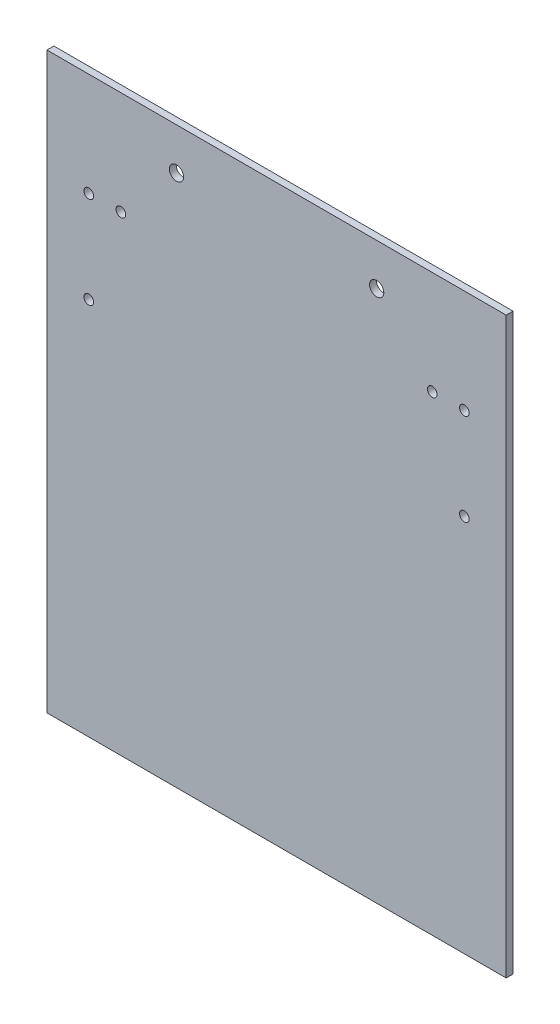
ISO-10303-21;
HEADER;
FILE_DESCRIPTION(('STEP AP214'),'2;1');
FILE_NAME('part.step','',(''),(''),'','','');
FILE_SCHEMA(('AUTOMOTIVE_DESIGN { 1 0 10303 214 1 1 1 1 }'));
ENDSEC;
DATA;
#1=APPLICATION_CONTEXT('core data for automotive mechanical design processes');
#2=APPLICATION_PROTOCOL_DEFINITION('international standard','automotive_design',2000,#1);
#3=PRODUCT_CONTEXT('',#1,'mechanical');
#4=PRODUCT('Part','Part','',(#3));
#5=PRODUCT_RELATED_PRODUCT_CATEGORY('part','',(#4));
#6=PRODUCT_DEFINITION_FORMATION('','',#4);
#7=PRODUCT_DEFINITION_CONTEXT('part definition',#1,'design');
#8=PRODUCT_DEFINITION('design','',#6,#7);
#9=PRODUCT_DEFINITION_SHAPE('','',#8);
#10=(LENGTH_UNIT() NAMED_UNIT(*) SI_UNIT(.MILLI.,.METRE.));
#11=(NAMED_UNIT(*) PLANE_ANGLE_UNIT() SI_UNIT($,.RADIAN.));
#12=(NAMED_UNIT(*) SI_UNIT($,.STERADIAN.) SOLID_ANGLE_UNIT());
#13=UNCERTAINTY_MEASURE_WITH_UNIT(LENGTH_MEASURE(1.E-05),#10,'distance_accuracy_value','');
#14=(GEOMETRIC_REPRESENTATION_CONTEXT(3) GLOBAL_UNCERTAINTY_ASSIGNED_CONTEXT((#13)) GLOBAL_UNIT_ASSIGNED_CONTEXT((#10,
#11,#12)) REPRESENTATION_CONTEXT('',''));
#15=CARTESIAN_POINT('',(0.,0.,0.));
#16=DIRECTION('',(0.,0.,1.));
#17=DIRECTION('',(1.,0.,0.));
#18=AXIS2_PLACEMENT_3D('',#15,#16,#17);
#19=CARTESIAN_POINT('',(0.,0.,3.));
#20=DIRECTION('',(0.,0.,-1.));
#21=DIRECTION('',(-1.,0.,0.));
#22=AXIS2_PLACEMENT_3D('',#19,#20,#21);
#23=PLANE('',#22);
#24=CARTESIAN_POINT('',(56.4,231.8,3.));
#25=DIRECTION('',(0.,0.,1.));
#26=DIRECTION('',(1.,0.,0.));
#27=AXIS2_PLACEMENT_3D('',#24,#25,#26);
#28=CIRCLE('',#27,3.10000000000001);
#29=CARTESIAN_POINT('',(59.5,231.8,3.));
#30=VERTEX_POINT('',#29);
#31=EDGE_CURVE('E140',#30,#30,#28,.T.);
#32=ORIENTED_EDGE('',*,*,#31,.F.);
#33=EDGE_LOOP('',(#32));
#34=FACE_BOUND('',#33,.T.);
#35=CARTESIAN_POINT('',(18.2,205.,3.));
#36=DIRECTION('',(0.,0.,1.));
#37=DIRECTION('',(1.,0.,0.));
#38=AXIS2_PLACEMENT_3D('',#35,#36,#37);
#39=CIRCLE('',#38,2.09999999999999);
#40=CARTESIAN_POINT('',(20.3,205.,3.));
#41=VERTEX_POINT('',#40);
#42=EDGE_CURVE('E149',#41,#41,#39,.T.);
#43=ORIENTED_EDGE('',*,*,#42,.F.);
#44=EDGE_LOOP('',(#43));
#45=FACE_BOUND('',#44,.T.);
#46=CARTESIAN_POINT('',(32.2,205.,3.));
#47=DIRECTION('',(0.,0.,1.));
#48=DIRECTION('',(1.,0.,0.));
#49=AXIS2_PLACEMENT_3D('',#46,#47,#48);
#50=CIRCLE('',#49,2.09999999999999);
#51=CARTESIAN_POINT('',(34.3,205.,3.));
#52=VERTEX_POINT('',#51);
#53=EDGE_CURVE('E188',#52,#52,#50,.T.);
#54=ORIENTED_EDGE('',*,*,#53,.F.);
#55=EDGE_LOOP('',(#54));
#56=FACE_BOUND('',#55,.T.);
#57=CARTESIAN_POINT('',(18.2,165.,3.));
#58=DIRECTION('',(0.,0.,1.));
#59=DIRECTION('',(1.,0.,0.));
#60=AXIS2_PLACEMENT_3D('',#57,#58,#59);
#61=CIRCLE('',#60,2.09999999999999);
#62=CARTESIAN_POINT('',(20.3,165.,3.));
#63=VERTEX_POINT('',#62);
#64=EDGE_CURVE('E136',#63,#63,#61,.T.);
#65=ORIENTED_EDGE('',*,*,#64,.F.);
#66=EDGE_LOOP('',(#65));
#67=FACE_BOUND('',#66,.T.);
#68=DIRECTION('',(0.,-1.,0.));
#69=VECTOR('',#68,1.);
#70=CARTESIAN_POINT('',(0.,0.,3.));
#71=LINE('',#70,#69);
#72=CARTESIAN_POINT('',(0.,250.,3.));
#73=VERTEX_POINT('',#72);
#74=CARTESIAN_POINT('',(0.,0.,3.));
#75=VERTEX_POINT('',#74);
#76=EDGE_CURVE('E98',#73,#75,#71,.T.);
#77=ORIENTED_EDGE('',*,*,#76,.T.);
#78=DIRECTION('',(1.,0.,0.));
#79=VECTOR('',#78,1.);
#80=CARTESIAN_POINT('',(0.,0.,3.));
#81=LINE('',#80,#79);
#82=CARTESIAN_POINT('',(200.,0.,3.));
#83=VERTEX_POINT('',#82);
#84=EDGE_CURVE('E93',#75,#83,#81,.T.);
#85=ORIENTED_EDGE('',*,*,#84,.T.);
#86=DIRECTION('',(0.,1.,0.));
#87=VECTOR('',#86,1.);
#88=CARTESIAN_POINT('',(200.,0.,3.));
#89=LINE('',#88,#87);
#90=CARTESIAN_POINT('',(200.,250.,3.));
#91=VERTEX_POINT('',#90);
#92=EDGE_CURVE('E96',#83,#91,#89,.T.);
#93=ORIENTED_EDGE('',*,*,#92,.T.);
#94=DIRECTION('',(-1.,0.,0.));
#95=VECTOR('',#94,1.);
#96=CARTESIAN_POINT('',(0.,250.,3.));
#97=LINE('',#96,#95);
#98=EDGE_CURVE('E63',#91,#73,#97,.T.);
#99=ORIENTED_EDGE('',*,*,#98,.T.);
#100=EDGE_LOOP('',(#77,#85,#93,#99));
#101=FACE_BOUND('',#100,.T.);
#102=CARTESIAN_POINT('',(181.8,165.,3.));
#103=DIRECTION('',(0.,0.,-1.));
#104=DIRECTION('',(-1.,0.,0.));
#105=AXIS2_PLACEMENT_3D('',#102,#103,#104);
#106=CIRCLE('',#105,2.10000000000001);
#107=CARTESIAN_POINT('',(179.7,165.,3.));
#108=VERTEX_POINT('',#107);
#109=EDGE_CURVE('E180',#108,#108,#106,.T.);
#110=ORIENTED_EDGE('',*,*,#109,.T.);
#111=EDGE_LOOP('',(#110));
#112=FACE_BOUND('',#111,.T.);
#113=CARTESIAN_POINT('',(181.8,205.,3.));
#114=DIRECTION('',(0.,0.,1.));
#115=DIRECTION('',(1.,0.,0.));
#116=AXIS2_PLACEMENT_3D('',#113,#114,#115);
#117=CIRCLE('',#116,2.10000000000001);
#118=CARTESIAN_POINT('',(183.9,205.,3.));
#119=VERTEX_POINT('',#118);
#120=EDGE_CURVE('E148',#119,#119,#117,.F.);
#121=ORIENTED_EDGE('',*,*,#120,.T.);
#122=EDGE_LOOP('',(#121));
#123=FACE_BOUND('',#122,.T.);
#124=CARTESIAN_POINT('',(167.8,205.,3.));
#125=DIRECTION('',(0.,0.,1.));
#126=DIRECTION('',(1.,0.,0.));
#127=AXIS2_PLACEMENT_3D('',#124,#125,#126);
#128=CIRCLE('',#127,2.09999999999999);
#129=CARTESIAN_POINT('',(169.9,205.,3.));
#130=VERTEX_POINT('',#129);
#131=EDGE_CURVE('E157',#130,#130,#128,.F.);
#132=ORIENTED_EDGE('',*,*,#131,.T.);
#133=EDGE_LOOP('',(#132));
#134=FACE_BOUND('',#133,.T.);
#135=CARTESIAN_POINT('',(143.6,231.8,3.));
#136=DIRECTION('',(0.,0.,1.));
#137=DIRECTION('',(1.,0.,0.));
#138=AXIS2_PLACEMENT_3D('',#135,#136,#137);
#139=CIRCLE('',#138,3.10000000000001);
#140=CARTESIAN_POINT('',(146.7,231.8,3.));
#141=VERTEX_POINT('',#140);
#142=EDGE_CURVE('E165',#141,#141,#139,.F.);
#143=ORIENTED_EDGE('',*,*,#142,.T.);
#144=EDGE_LOOP('',(#143));
#145=FACE_BOUND('',#144,.T.);
#146=ADVANCED_FACE('F45',(#34,#45,#56,#67,#101,#112,#123,#134,#145),#23,.F.);
#147=CARTESIAN_POINT('',(0.,0.,0.));
#148=DIRECTION('',(0.,0.,-1.));
#149=DIRECTION('',(-1.,0.,0.));
#150=AXIS2_PLACEMENT_3D('',#147,#148,#149);
#151=PLANE('',#150);
#152=CARTESIAN_POINT('',(56.4,231.8,0.));
#153=DIRECTION('',(0.,0.,1.));
#154=DIRECTION('',(1.,0.,0.));
#155=AXIS2_PLACEMENT_3D('',#152,#153,#154);
#156=CIRCLE('',#155,3.10000000000001);
#157=CARTESIAN_POINT('',(59.5,231.8,0.));
#158=VERTEX_POINT('',#157);
#159=EDGE_CURVE('E169',#158,#158,#156,.T.);
#160=ORIENTED_EDGE('',*,*,#159,.T.);
#161=EDGE_LOOP('',(#160));
#162=FACE_BOUND('',#161,.T.);
#163=CARTESIAN_POINT('',(167.8,205.,0.));
#164=DIRECTION('',(0.,0.,1.));
#165=DIRECTION('',(1.,0.,0.));
#166=AXIS2_PLACEMENT_3D('',#163,#164,#165);
#167=CIRCLE('',#166,2.09999999999999);
#168=CARTESIAN_POINT('',(169.9,205.,0.));
#169=VERTEX_POINT('',#168);
#170=EDGE_CURVE('E153',#169,#169,#167,.F.);
#171=ORIENTED_EDGE('',*,*,#170,.F.);
#172=EDGE_LOOP('',(#171));
#173=FACE_BOUND('',#172,.T.);
#174=CARTESIAN_POINT('',(181.8,165.,0.));
#175=DIRECTION('',(0.,0.,-1.));
#176=DIRECTION('',(-1.,0.,0.));
#177=AXIS2_PLACEMENT_3D('',#174,#175,#176);
#178=CIRCLE('',#177,2.10000000000001);
#179=CARTESIAN_POINT('',(179.7,165.,0.));
#180=VERTEX_POINT('',#179);
#181=EDGE_CURVE('E176',#180,#180,#178,.T.);
#182=ORIENTED_EDGE('',*,*,#181,.F.);
#183=EDGE_LOOP('',(#182));
#184=FACE_BOUND('',#183,.T.);
#185=CARTESIAN_POINT('',(18.2,165.,0.));
#186=DIRECTION('',(0.,0.,1.));
#187=DIRECTION('',(1.,0.,0.));
#188=AXIS2_PLACEMENT_3D('',#185,#186,#187);
#189=CIRCLE('',#188,2.09999999999999);
#190=CARTESIAN_POINT('',(20.3,165.,0.));
#191=VERTEX_POINT('',#190);
#192=EDGE_CURVE('E118',#191,#191,#189,.T.);
#193=ORIENTED_EDGE('',*,*,#192,.T.);
#194=EDGE_LOOP('',(#193));
#195=FACE_BOUND('',#194,.T.);
#196=DIRECTION('',(0.,-1.,0.));
#197=VECTOR('',#196,1.);
#198=CARTESIAN_POINT('',(0.,0.,0.));
#199=LINE('',#198,#197);
#200=CARTESIAN_POINT('',(0.,250.,0.));
#201=VERTEX_POINT('',#200);
#202=CARTESIAN_POINT('',(0.,0.,0.));
#203=VERTEX_POINT('',#202);
#204=EDGE_CURVE('E114',#201,#203,#199,.T.);
#205=ORIENTED_EDGE('',*,*,#204,.F.);
#206=DIRECTION('',(-1.,0.,0.));
#207=VECTOR('',#206,1.);
#208=CARTESIAN_POINT('',(0.,250.,0.));
#209=LINE('',#208,#207);
#210=CARTESIAN_POINT('',(200.,250.,0.));
#211=VERTEX_POINT('',#210);
#212=EDGE_CURVE('E86',#211,#201,#209,.T.);
#213=ORIENTED_EDGE('',*,*,#212,.F.);
#214=DIRECTION('',(0.,1.,0.));
#215=VECTOR('',#214,1.);
#216=CARTESIAN_POINT('',(200.,0.,0.));
#217=LINE('',#216,#215);
#218=CARTESIAN_POINT('',(200.,0.,0.));
#219=VERTEX_POINT('',#218);
#220=EDGE_CURVE('E80',#219,#211,#217,.T.);
#221=ORIENTED_EDGE('',*,*,#220,.F.);
#222=DIRECTION('',(1.,0.,0.));
#223=VECTOR('',#222,1.);
#224=CARTESIAN_POINT('',(0.,0.,0.));
#225=LINE('',#224,#223);
#226=EDGE_CURVE('E103',#203,#219,#225,.T.);
#227=ORIENTED_EDGE('',*,*,#226,.F.);
#228=EDGE_LOOP('',(#205,#213,#221,#227));
#229=FACE_BOUND('',#228,.T.);
#230=CARTESIAN_POINT('',(32.2,205.,0.));
#231=DIRECTION('',(0.,0.,1.));
#232=DIRECTION('',(1.,0.,0.));
#233=AXIS2_PLACEMENT_3D('',#230,#231,#232);
#234=CIRCLE('',#233,2.09999999999999);
#235=CARTESIAN_POINT('',(34.3,205.,0.));
#236=VERTEX_POINT('',#235);
#237=EDGE_CURVE('E184',#236,#236,#234,.T.);
#238=ORIENTED_EDGE('',*,*,#237,.T.);
#239=EDGE_LOOP('',(#238));
#240=FACE_BOUND('',#239,.T.);
#241=CARTESIAN_POINT('',(18.2,205.,0.));
#242=DIRECTION('',(0.,0.,1.));
#243=DIRECTION('',(1.,0.,0.));
#244=AXIS2_PLACEMENT_3D('',#241,#242,#243);
#245=CIRCLE('',#244,2.09999999999999);
#246=CARTESIAN_POINT('',(20.3,205.,0.));
#247=VERTEX_POINT('',#246);
#248=EDGE_CURVE('E192',#247,#247,#245,.T.);
#249=ORIENTED_EDGE('',*,*,#248,.T.);
#250=EDGE_LOOP('',(#249));
#251=FACE_BOUND('',#250,.T.);
#252=CARTESIAN_POINT('',(181.8,205.,0.));
#253=DIRECTION('',(0.,0.,1.));
#254=DIRECTION('',(1.,0.,0.));
#255=AXIS2_PLACEMENT_3D('',#252,#253,#254);
#256=CIRCLE('',#255,2.10000000000001);
#257=CARTESIAN_POINT('',(183.9,205.,0.));
#258=VERTEX_POINT('',#257);
#259=EDGE_CURVE('E144',#258,#258,#256,.F.);
#260=ORIENTED_EDGE('',*,*,#259,.F.);
#261=EDGE_LOOP('',(#260));
#262=FACE_BOUND('',#261,.T.);
#263=CARTESIAN_POINT('',(143.6,231.8,0.));
#264=DIRECTION('',(0.,0.,1.));
#265=DIRECTION('',(1.,0.,0.));
#266=AXIS2_PLACEMENT_3D('',#263,#264,#265);
#267=CIRCLE('',#266,3.10000000000001);
#268=CARTESIAN_POINT('',(146.7,231.8,0.));
#269=VERTEX_POINT('',#268);
#270=EDGE_CURVE('E161',#269,#269,#267,.F.);
#271=ORIENTED_EDGE('',*,*,#270,.F.);
#272=EDGE_LOOP('',(#271));
#273=FACE_BOUND('',#272,.T.);
#274=ADVANCED_FACE('F131',(#162,#173,#184,#195,#229,#240,#251,#262,#273),#151,.T.);
#275=CARTESIAN_POINT('',(0.,0.,3.));
#276=DIRECTION('',(1.,0.,0.));
#277=DIRECTION('',(0.,0.,-1.));
#278=AXIS2_PLACEMENT_3D('',#275,#276,#277);
#279=PLANE('',#278);
#280=ORIENTED_EDGE('',*,*,#204,.T.);
#281=DIRECTION('',(0.,0.,-1.));
#282=VECTOR('',#281,1.);
#283=CARTESIAN_POINT('',(0.,0.,3.));
#284=LINE('',#283,#282);
#285=EDGE_CURVE('E11',#75,#203,#284,.T.);
#286=ORIENTED_EDGE('',*,*,#285,.F.);
#287=ORIENTED_EDGE('',*,*,#76,.F.);
#288=DIRECTION('',(0.,0.,-1.));
#289=VECTOR('',#288,1.);
#290=CARTESIAN_POINT('',(0.,250.,3.));
#291=LINE('',#290,#289);
#292=EDGE_CURVE('E110',#73,#201,#291,.T.);
#293=ORIENTED_EDGE('',*,*,#292,.T.);
#294=EDGE_LOOP('',(#280,#286,#287,#293));
#295=FACE_BOUND('',#294,.T.);
#296=ADVANCED_FACE('F47',(#295),#279,.F.);
#297=CARTESIAN_POINT('',(0.,0.,3.));
#298=DIRECTION('',(0.,1.,0.));
#299=DIRECTION('',(0.,0.,1.));
#300=AXIS2_PLACEMENT_3D('',#297,#298,#299);
#301=PLANE('',#300);
#302=ORIENTED_EDGE('',*,*,#226,.T.);
#303=DIRECTION('',(0.,0.,-1.));
#304=VECTOR('',#303,1.);
#305=CARTESIAN_POINT('',(200.,0.,3.));
#306=LINE('',#305,#304);
#307=EDGE_CURVE('E55',#83,#219,#306,.T.);
#308=ORIENTED_EDGE('',*,*,#307,.F.);
#309=ORIENTED_EDGE('',*,*,#84,.F.);
#310=ORIENTED_EDGE('',*,*,#285,.T.);
#311=EDGE_LOOP('',(#302,#308,#309,#310));
#312=FACE_BOUND('',#311,.T.);
#313=ADVANCED_FACE('F102',(#312),#301,.F.);
#314=CARTESIAN_POINT('',(200.,0.,3.));
#315=DIRECTION('',(-1.,0.,0.));
#316=DIRECTION('',(0.,0.,1.));
#317=AXIS2_PLACEMENT_3D('',#314,#315,#316);
#318=PLANE('',#317);
#319=ORIENTED_EDGE('',*,*,#220,.T.);
#320=DIRECTION('',(0.,0.,-1.));
#321=VECTOR('',#320,1.);
#322=CARTESIAN_POINT('',(200.,250.,3.));
#323=LINE('',#322,#321);
#324=EDGE_CURVE('E105',#91,#211,#323,.T.);
#325=ORIENTED_EDGE('',*,*,#324,.F.);
#326=ORIENTED_EDGE('',*,*,#92,.F.);
#327=ORIENTED_EDGE('',*,*,#307,.T.);
#328=EDGE_LOOP('',(#319,#325,#326,#327));
#329=FACE_BOUND('',#328,.T.);
#330=ADVANCED_FACE('F106',(#329),#318,.F.);
#331=CARTESIAN_POINT('',(0.,250.,3.));
#332=DIRECTION('',(0.,-1.,0.));
#333=DIRECTION('',(0.,0.,-1.));
#334=AXIS2_PLACEMENT_3D('',#331,#332,#333);
#335=PLANE('',#334);
#336=ORIENTED_EDGE('',*,*,#212,.T.);
#337=ORIENTED_EDGE('',*,*,#292,.F.);
#338=ORIENTED_EDGE('',*,*,#98,.F.);
#339=ORIENTED_EDGE('',*,*,#324,.T.);
#340=EDGE_LOOP('',(#336,#337,#338,#339));
#341=FACE_BOUND('',#340,.T.);
#342=ADVANCED_FACE('F128',(#341),#335,.F.);
#343=CARTESIAN_POINT('',(18.2,165.,0.));
#344=DIRECTION('',(0.,0.,1.));
#345=DIRECTION('',(1.,0.,0.));
#346=AXIS2_PLACEMENT_3D('',#343,#344,#345);
#347=CYLINDRICAL_SURFACE('',#346,2.09999999999999);
#348=ORIENTED_EDGE('',*,*,#192,.F.);
#349=EDGE_LOOP('',(#348));
#350=FACE_BOUND('',#349,.T.);
#351=ORIENTED_EDGE('',*,*,#64,.T.);
#352=EDGE_LOOP('',(#351));
#353=FACE_BOUND('',#352,.T.);
#354=ADVANCED_FACE('F210',(#350,#353),#347,.F.);
#355=CARTESIAN_POINT('',(181.8,165.,0.));
#356=DIRECTION('',(0.,0.,1.));
#357=DIRECTION('',(1.,0.,0.));
#358=AXIS2_PLACEMENT_3D('',#355,#356,#357);
#359=CYLINDRICAL_SURFACE('',#358,2.10000000000001);
#360=ORIENTED_EDGE('',*,*,#181,.T.);
#361=EDGE_LOOP('',(#360));
#362=FACE_BOUND('',#361,.T.);
#363=ORIENTED_EDGE('',*,*,#109,.F.);
#364=EDGE_LOOP('',(#363));
#365=FACE_BOUND('',#364,.T.);
#366=ADVANCED_FACE('F212',(#362,#365),#359,.F.);
#367=CARTESIAN_POINT('',(32.2,205.,0.));
#368=DIRECTION('',(0.,0.,1.));
#369=DIRECTION('',(1.,0.,0.));
#370=AXIS2_PLACEMENT_3D('',#367,#368,#369);
#371=CYLINDRICAL_SURFACE('',#370,2.09999999999999);
#372=ORIENTED_EDGE('',*,*,#237,.F.);
#373=EDGE_LOOP('',(#372));
#374=FACE_BOUND('',#373,.T.);
#375=ORIENTED_EDGE('',*,*,#53,.T.);
#376=EDGE_LOOP('',(#375));
#377=FACE_BOUND('',#376,.T.);
#378=ADVANCED_FACE('F219',(#374,#377),#371,.F.);
#379=CARTESIAN_POINT('',(18.2,205.,0.));
#380=DIRECTION('',(0.,0.,1.));
#381=DIRECTION('',(1.,0.,0.));
#382=AXIS2_PLACEMENT_3D('',#379,#380,#381);
#383=CYLINDRICAL_SURFACE('',#382,2.09999999999999);
#384=ORIENTED_EDGE('',*,*,#248,.F.);
#385=EDGE_LOOP('',(#384));
#386=FACE_BOUND('',#385,.T.);
#387=ORIENTED_EDGE('',*,*,#42,.T.);
#388=EDGE_LOOP('',(#387));
#389=FACE_BOUND('',#388,.T.);
#390=ADVANCED_FACE('F200',(#386,#389),#383,.F.);
#391=CARTESIAN_POINT('',(181.8,205.,0.));
#392=DIRECTION('',(0.,0.,1.));
#393=DIRECTION('',(1.,0.,0.));
#394=AXIS2_PLACEMENT_3D('',#391,#392,#393);
#395=CYLINDRICAL_SURFACE('',#394,2.10000000000001);
#396=ORIENTED_EDGE('',*,*,#259,.T.);
#397=EDGE_LOOP('',(#396));
#398=FACE_BOUND('',#397,.T.);
#399=ORIENTED_EDGE('',*,*,#120,.F.);
#400=EDGE_LOOP('',(#399));
#401=FACE_BOUND('',#400,.T.);
#402=ADVANCED_FACE('F226',(#398,#401),#395,.F.);
#403=CARTESIAN_POINT('',(167.8,205.,0.));
#404=DIRECTION('',(0.,0.,1.));
#405=DIRECTION('',(1.,0.,0.));
#406=AXIS2_PLACEMENT_3D('',#403,#404,#405);
#407=CYLINDRICAL_SURFACE('',#406,2.09999999999999);
#408=ORIENTED_EDGE('',*,*,#170,.T.);
#409=EDGE_LOOP('',(#408));
#410=FACE_BOUND('',#409,.T.);
#411=ORIENTED_EDGE('',*,*,#131,.F.);
#412=EDGE_LOOP('',(#411));
#413=FACE_BOUND('',#412,.T.);
#414=ADVANCED_FACE('F304',(#410,#413),#407,.F.);
#415=CARTESIAN_POINT('',(143.6,231.8,0.));
#416=DIRECTION('',(0.,0.,1.));
#417=DIRECTION('',(1.,0.,0.));
#418=AXIS2_PLACEMENT_3D('',#415,#416,#417);
#419=CYLINDRICAL_SURFACE('',#418,3.10000000000001);
#420=ORIENTED_EDGE('',*,*,#270,.T.);
#421=EDGE_LOOP('',(#420));
#422=FACE_BOUND('',#421,.T.);
#423=ORIENTED_EDGE('',*,*,#142,.F.);
#424=EDGE_LOOP('',(#423));
#425=FACE_BOUND('',#424,.T.);
#426=ADVANCED_FACE('F313',(#422,#425),#419,.F.);
#427=CARTESIAN_POINT('',(56.4,231.8,0.));
#428=DIRECTION('',(0.,0.,1.));
#429=DIRECTION('',(1.,0.,0.));
#430=AXIS2_PLACEMENT_3D('',#427,#428,#429);
#431=CYLINDRICAL_SURFACE('',#430,3.10000000000001);
#432=ORIENTED_EDGE('',*,*,#159,.F.);
#433=EDGE_LOOP('',(#432));
#434=FACE_BOUND('',#433,.T.);
#435=ORIENTED_EDGE('',*,*,#31,.T.);
#436=EDGE_LOOP('',(#435));
#437=FACE_BOUND('',#436,.T.);
#438=ADVANCED_FACE('F322',(#434,#437),#431,.F.);
#439=CLOSED_SHELL('',(#146,#274,#296,#313,#330,#342,#354,#366,#378,#390,#402,#414,#426,#438));
#440=MANIFOLD_SOLID_BREP('B2',#439);
#441=ADVANCED_BREP_SHAPE_REPRESENTATION('',(#18,#440),#14);
#442=SHAPE_DEFINITION_REPRESENTATION(#9,#441);
ENDSEC;
END-ISO-10303-21;
